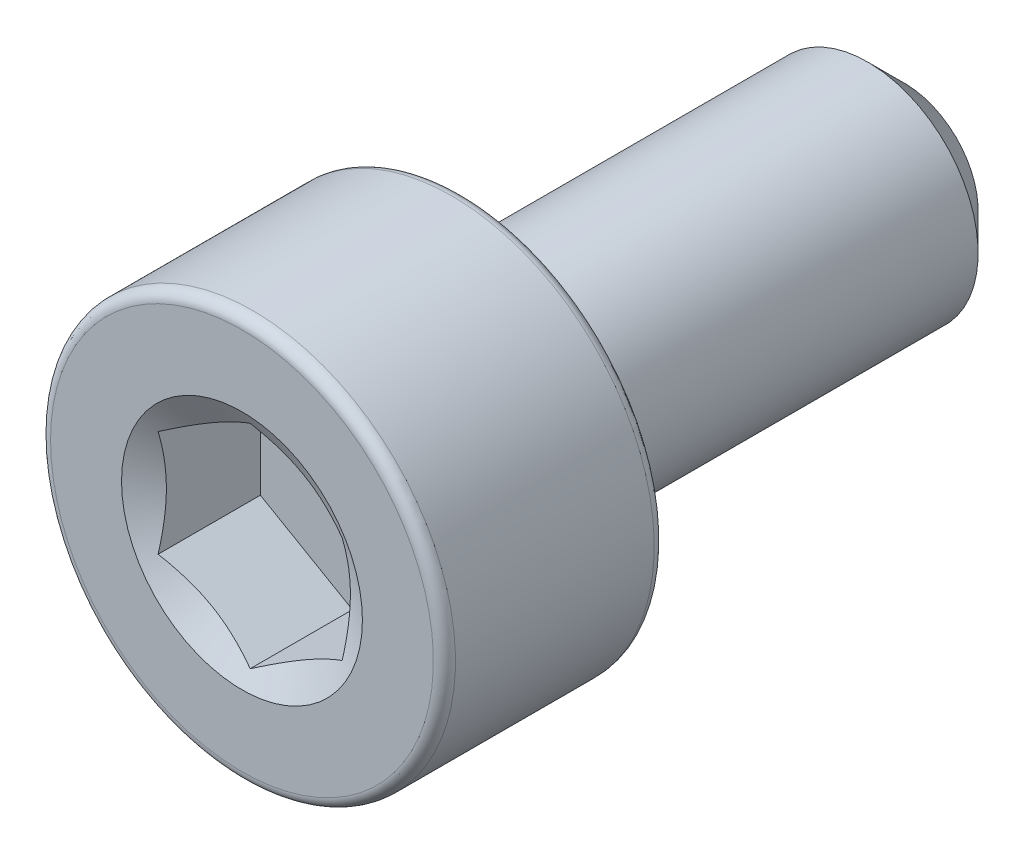
ISO-10303-21;
HEADER;
FILE_DESCRIPTION(('STEP AP214'),'2;1');
FILE_NAME('part.step','',(''),(''),'','','');
FILE_SCHEMA(('AUTOMOTIVE_DESIGN { 1 0 10303 214 1 1 1 1 }'));
ENDSEC;
DATA;
#1=APPLICATION_CONTEXT('core data for automotive mechanical design processes');
#2=APPLICATION_PROTOCOL_DEFINITION('international standard','automotive_design',2000,#1);
#3=PRODUCT_CONTEXT('',#1,'mechanical');
#4=PRODUCT('Part','Part','',(#3));
#5=PRODUCT_RELATED_PRODUCT_CATEGORY('part','',(#4));
#6=PRODUCT_DEFINITION_FORMATION('','',#4);
#7=PRODUCT_DEFINITION_CONTEXT('part definition',#1,'design');
#8=PRODUCT_DEFINITION('design','',#6,#7);
#9=PRODUCT_DEFINITION_SHAPE('','',#8);
#10=(LENGTH_UNIT() NAMED_UNIT(*) SI_UNIT(.MILLI.,.METRE.));
#11=(NAMED_UNIT(*) PLANE_ANGLE_UNIT() SI_UNIT($,.RADIAN.));
#12=(NAMED_UNIT(*) SI_UNIT($,.STERADIAN.) SOLID_ANGLE_UNIT());
#13=UNCERTAINTY_MEASURE_WITH_UNIT(LENGTH_MEASURE(1.E-05),#10,'distance_accuracy_value','');
#14=(GEOMETRIC_REPRESENTATION_CONTEXT(3) GLOBAL_UNCERTAINTY_ASSIGNED_CONTEXT((#13)) GLOBAL_UNIT_ASSIGNED_CONTEXT((#10,
#11,#12)) REPRESENTATION_CONTEXT('',''));
#15=CARTESIAN_POINT('',(0.,0.,0.));
#16=DIRECTION('',(0.,0.,1.));
#17=DIRECTION('',(1.,0.,0.));
#18=AXIS2_PLACEMENT_3D('',#15,#16,#17);
#19=CARTESIAN_POINT('',(0.,0.,-4.5));
#20=DIRECTION('',(0.,0.,-1.));
#21=DIRECTION('',(-1.,0.,0.));
#22=AXIS2_PLACEMENT_3D('',#19,#20,#21);
#23=PLANE('',#22);
#24=CARTESIAN_POINT('',(0.,0.,-4.5));
#25=DIRECTION('',(0.,0.,-1.));
#26=DIRECTION('',(-1.,0.,0.));
#27=AXIS2_PLACEMENT_3D('',#24,#25,#26);
#28=CIRCLE('',#27,1.);
#29=CARTESIAN_POINT('',(-1.,0.,-4.5));
#30=VERTEX_POINT('',#29);
#31=EDGE_CURVE('E54',#30,#30,#28,.T.);
#32=ORIENTED_EDGE('',*,*,#31,.T.);
#33=EDGE_LOOP('',(#32));
#34=FACE_BOUND('',#33,.T.);
#35=ADVANCED_FACE('F41',(#34),#23,.T.);
#36=CARTESIAN_POINT('',(0.,0.,-4.5));
#37=DIRECTION('',(0.,0.,1.));
#38=DIRECTION('',(1.,0.,0.));
#39=AXIS2_PLACEMENT_3D('',#36,#37,#38);
#40=CONICAL_SURFACE('',#39,1.,0.785398163397448);
#41=CARTESIAN_POINT('',(0.,0.,-4.));
#42=DIRECTION('',(0.,0.,-1.));
#43=DIRECTION('',(-1.,0.,0.));
#44=AXIS2_PLACEMENT_3D('',#41,#42,#43);
#45=CIRCLE('',#44,1.5);
#46=CARTESIAN_POINT('',(-1.5,0.,-4.));
#47=VERTEX_POINT('',#46);
#48=EDGE_CURVE('E139',#47,#47,#45,.T.);
#49=ORIENTED_EDGE('',*,*,#48,.T.);
#50=EDGE_LOOP('',(#49));
#51=FACE_BOUND('',#50,.T.);
#52=ORIENTED_EDGE('',*,*,#31,.F.);
#53=EDGE_LOOP('',(#52));
#54=FACE_BOUND('',#53,.T.);
#55=ADVANCED_FACE('F145',(#51,#54),#40,.T.);
#56=CARTESIAN_POINT('',(0.,0.,-4.5));
#57=DIRECTION('',(0.,0.,-1.));
#58=DIRECTION('',(-1.,0.,0.));
#59=AXIS2_PLACEMENT_3D('',#56,#57,#58);
#60=CYLINDRICAL_SURFACE('',#59,1.5);
#61=CARTESIAN_POINT('',(0.,0.,1.5));
#62=DIRECTION('',(0.,0.,-1.));
#63=DIRECTION('',(-1.,0.,0.));
#64=AXIS2_PLACEMENT_3D('',#61,#62,#63);
#65=CIRCLE('',#64,1.5);
#66=CARTESIAN_POINT('',(-1.5,0.,1.5));
#67=VERTEX_POINT('',#66);
#68=EDGE_CURVE('E136',#67,#67,#65,.T.);
#69=ORIENTED_EDGE('',*,*,#68,.T.);
#70=EDGE_LOOP('',(#69));
#71=FACE_BOUND('',#70,.T.);
#72=ORIENTED_EDGE('',*,*,#48,.F.);
#73=EDGE_LOOP('',(#72));
#74=FACE_BOUND('',#73,.T.);
#75=ADVANCED_FACE('F147',(#71,#74),#60,.T.);
#76=CARTESIAN_POINT('',(0.,1.5,1.5));
#77=DIRECTION('',(0.,0.,-1.));
#78=DIRECTION('',(-1.,0.,0.));
#79=AXIS2_PLACEMENT_3D('',#76,#77,#78);
#80=PLANE('',#79);
#81=CARTESIAN_POINT('',(0.,0.,1.5));
#82=DIRECTION('',(0.,0.,-1.));
#83=DIRECTION('',(-1.,0.,0.));
#84=AXIS2_PLACEMENT_3D('',#81,#82,#83);
#85=CIRCLE('',#84,2.6);
#86=CARTESIAN_POINT('',(-2.6,0.,1.5));
#87=VERTEX_POINT('',#86);
#88=EDGE_CURVE('E133',#87,#87,#85,.T.);
#89=ORIENTED_EDGE('',*,*,#88,.T.);
#90=EDGE_LOOP('',(#89));
#91=FACE_BOUND('',#90,.T.);
#92=ORIENTED_EDGE('',*,*,#68,.F.);
#93=EDGE_LOOP('',(#92));
#94=FACE_BOUND('',#93,.T.);
#95=ADVANCED_FACE('F153',(#91,#94),#80,.T.);
#96=CARTESIAN_POINT('',(0.,0.,1.65));
#97=DIRECTION('',(0.,0.,-1.));
#98=DIRECTION('',(-1.,0.,0.));
#99=AXIS2_PLACEMENT_3D('',#96,#97,#98);
#100=TOROIDAL_SURFACE('',#99,2.6,0.15);
#101=CARTESIAN_POINT('',(0.,0.,1.65));
#102=DIRECTION('',(0.,0.,-1.));
#103=DIRECTION('',(-1.,0.,0.));
#104=AXIS2_PLACEMENT_3D('',#101,#102,#103);
#105=CIRCLE('',#104,2.75);
#106=CARTESIAN_POINT('',(-2.75,0.,1.65));
#107=VERTEX_POINT('',#106);
#108=EDGE_CURVE('E130',#107,#107,#105,.T.);
#109=ORIENTED_EDGE('',*,*,#108,.T.);
#110=EDGE_LOOP('',(#109));
#111=FACE_BOUND('',#110,.T.);
#112=ORIENTED_EDGE('',*,*,#88,.F.);
#113=EDGE_LOOP('',(#112));
#114=FACE_BOUND('',#113,.T.);
#115=ADVANCED_FACE('F159',(#111,#114),#100,.T.);
#116=CARTESIAN_POINT('',(0.,0.,-4.5));
#117=DIRECTION('',(0.,0.,-1.));
#118=DIRECTION('',(-1.,0.,0.));
#119=AXIS2_PLACEMENT_3D('',#116,#117,#118);
#120=CYLINDRICAL_SURFACE('',#119,2.75);
#121=CARTESIAN_POINT('',(0.,0.,4.35));
#122=DIRECTION('',(0.,0.,-1.));
#123=DIRECTION('',(-1.,0.,0.));
#124=AXIS2_PLACEMENT_3D('',#121,#122,#123);
#125=CIRCLE('',#124,2.75);
#126=CARTESIAN_POINT('',(-2.75,0.,4.35));
#127=VERTEX_POINT('',#126);
#128=EDGE_CURVE('E127',#127,#127,#125,.T.);
#129=ORIENTED_EDGE('',*,*,#128,.T.);
#130=EDGE_LOOP('',(#129));
#131=FACE_BOUND('',#130,.T.);
#132=ORIENTED_EDGE('',*,*,#108,.F.);
#133=EDGE_LOOP('',(#132));
#134=FACE_BOUND('',#133,.T.);
#135=ADVANCED_FACE('F163',(#131,#134),#120,.T.);
#136=CARTESIAN_POINT('',(0.,0.,4.35));
#137=DIRECTION('',(0.,0.,-1.));
#138=DIRECTION('',(-1.,0.,0.));
#139=AXIS2_PLACEMENT_3D('',#136,#137,#138);
#140=TOROIDAL_SURFACE('',#139,2.6,0.15);
#141=CARTESIAN_POINT('',(0.,0.,4.5));
#142=DIRECTION('',(0.,0.,-1.));
#143=DIRECTION('',(-1.,0.,0.));
#144=AXIS2_PLACEMENT_3D('',#141,#142,#143);
#145=CIRCLE('',#144,2.6);
#146=CARTESIAN_POINT('',(-2.6,0.,4.5));
#147=VERTEX_POINT('',#146);
#148=EDGE_CURVE('E124',#147,#147,#145,.T.);
#149=ORIENTED_EDGE('',*,*,#148,.T.);
#150=EDGE_LOOP('',(#149));
#151=FACE_BOUND('',#150,.T.);
#152=ORIENTED_EDGE('',*,*,#128,.F.);
#153=EDGE_LOOP('',(#152));
#154=FACE_BOUND('',#153,.T.);
#155=ADVANCED_FACE('F167',(#151,#154),#140,.T.);
#156=CARTESIAN_POINT('',(0.,2.6,4.5));
#157=DIRECTION('',(0.,0.,1.));
#158=DIRECTION('',(1.,0.,0.));
#159=AXIS2_PLACEMENT_3D('',#156,#157,#158);
#160=PLANE('',#159);
#161=CARTESIAN_POINT('',(0.,0.,4.5));
#162=DIRECTION('',(0.,0.,1.));
#163=DIRECTION('',(1.,0.,0.));
#164=AXIS2_PLACEMENT_3D('',#161,#162,#163);
#165=CIRCLE('',#164,1.63614639414505);
#166=CARTESIAN_POINT('',(1.63614639414505,0.,4.5));
#167=VERTEX_POINT('',#166);
#168=EDGE_CURVE('E261',#167,#167,#165,.T.);
#169=ORIENTED_EDGE('',*,*,#168,.F.);
#170=EDGE_LOOP('',(#169));
#171=FACE_BOUND('',#170,.T.);
#172=ORIENTED_EDGE('',*,*,#148,.F.);
#173=EDGE_LOOP('',(#172));
#174=FACE_BOUND('',#173,.T.);
#175=ADVANCED_FACE('F171',(#171,#174),#160,.T.);
#176=CARTESIAN_POINT('',(0.,0.,4.5));
#177=DIRECTION('',(0.,0.,1.));
#178=DIRECTION('',(1.,0.,0.));
#179=AXIS2_PLACEMENT_3D('',#176,#177,#178);
#180=CONICAL_SURFACE('',#179,1.63614639414505,1.0471975511966);
#181=ORIENTED_EDGE('',*,*,#168,.T.);
#182=EDGE_LOOP('',(#181));
#183=FACE_BOUND('',#182,.T.);
#184=CARTESIAN_POINT('',(1.2502,0.721572366433193,4.38877044690608));
#185=CARTESIAN_POINT('',(1.19526669476823,0.753288124996228,4.37044968700374));
#186=CARTESIAN_POINT('',(1.13985921349976,0.785277649221701,4.35378707844069));
#187=CARTESIAN_POINT('',(1.02808463239966,0.849810733708402,4.32470107618582));
#188=CARTESIAN_POINT('',(0.971715545158288,0.88235544140118,4.3122879742161));
#189=CARTESIAN_POINT('',(0.859676025913014,0.947041487997316,4.29296345987606));
#190=CARTESIAN_POINT('',(0.804022841540769,0.979172868975891,4.28592346168748));
#191=CARTESIAN_POINT('',(0.692454346091608,1.04358696985655,4.27751620487069));
#192=CARTESIAN_POINT('',(0.636539441062399,1.07586945532687,4.27614198744478));
#193=CARTESIAN_POINT('',(0.532042078818274,1.13620103554812,4.27898710960797));
#194=CARTESIAN_POINT('',(0.483444050118684,1.16425912049992,4.28250787106007));
#195=CARTESIAN_POINT('',(0.386564637826761,1.22019247526559,4.29367088493931));
#196=CARTESIAN_POINT('',(0.338283589807836,1.24806755133607,4.30131695781273));
#197=CARTESIAN_POINT('',(0.241204116145956,1.30411641158755,4.32043322694058));
#198=CARTESIAN_POINT('',(0.1924179896481,1.3322830948538,4.33198452921971));
#199=CARTESIAN_POINT('',(0.0955737477078969,1.38819614400745,4.35820208693394));
#200=CARTESIAN_POINT('',(0.0475143896730347,1.41594322730595,4.37286217437916));
#201=CARTESIAN_POINT('',(-0.000200000000000998,1.4434911430279,4.38877044690608));
#202=B_SPLINE_CURVE_WITH_KNOTS('',3,(#184,#185,#186,#187,#188,#189,#190,#191,#192,#193,#194,
#195,#196,#197,#198,#199,#200,#201),.UNSPECIFIED.,.F.,.F.,(4,2,2,2,2,2,2,2,4),(0.,
0.198150821029559,0.39677819631522,0.590488617354399,0.783961049317181,0.952480056398645,
1.1211553973001,1.2935743034359,1.4656542697693),.UNSPECIFIED.);
#203=CARTESIAN_POINT('',(1.25,0.721687836487031,4.38870377224005));
#204=VERTEX_POINT('',#203);
#205=CARTESIAN_POINT('',(0.,1.44337567297406,4.38870377224005));
#206=VERTEX_POINT('',#205);
#207=EDGE_CURVE('E108',#204,#206,#202,.T.);
#208=ORIENTED_EDGE('',*,*,#207,.F.);
#209=CARTESIAN_POINT('',(1.25,-1.89493751838585,4.86600491612075));
#210=CARTESIAN_POINT('',(1.25,-1.8406706655359,4.83985913696477));
#211=CARTESIAN_POINT('',(1.25,-1.78627450159955,4.81397718008943));
#212=CARTESIAN_POINT('',(1.25,-1.6771542860939,4.76289014495151));
#213=CARTESIAN_POINT('',(1.25,-1.62243018006471,4.73768518315142));
#214=CARTESIAN_POINT('',(1.25,-1.51228150660141,4.68796514956817));
#215=CARTESIAN_POINT('',(1.25,-1.45685471363782,4.66345498656184));
#216=CARTESIAN_POINT('',(1.25,-1.34554530711243,4.61549912463354));
#217=CARTESIAN_POINT('',(1.25,-1.28966271671259,4.59205337201483));
#218=CARTESIAN_POINT('',(1.25,-1.17576624467955,4.5458644070109));
#219=CARTESIAN_POINT('',(1.25,-1.1177366233874,4.52315949733902));
#220=CARTESIAN_POINT('',(1.25,-1.00099484939335,4.4795841161061));
#221=CARTESIAN_POINT('',(1.25,-0.942282613107527,4.45871387193022));
#222=CARTESIAN_POINT('',(1.25,-0.765204349689549,4.39970721918192));
#223=CARTESIAN_POINT('',(1.25,-0.645583882597418,4.36504221898047));
#224=CARTESIAN_POINT('',(1.25,-0.463875702209306,4.32448382828725));
#225=CARTESIAN_POINT('',(1.25,-0.403068506127043,4.31288446104471));
#226=CARTESIAN_POINT('',(1.25,-0.280742753480582,4.29425184547974));
#227=CARTESIAN_POINT('',(1.25,-0.21922425475773,4.28721822850307));
#228=CARTESIAN_POINT('',(1.25,-0.0965698763728662,4.27836802265131));
#229=CARTESIAN_POINT('',(1.25,-0.0354387064128372,4.27648784576509));
#230=CARTESIAN_POINT('',(1.25,0.0867606380824925,4.27793281417568));
#231=CARTESIAN_POINT('',(1.25,0.147828809085717,4.28125823697792));
#232=CARTESIAN_POINT('',(1.25,0.296976974516787,4.29544420543106));
#233=CARTESIAN_POINT('',(1.25,0.384798095172699,4.30902990246888));
#234=CARTESIAN_POINT('',(1.25,0.558777035574827,4.34447190806478));
#235=CARTESIAN_POINT('',(1.25,0.644932779078741,4.36633791854767));
#236=CARTESIAN_POINT('',(1.25,0.77380914518999,4.40387295213096));
#237=CARTESIAN_POINT('',(1.25,0.817192381742851,4.41735279334266));
#238=CARTESIAN_POINT('',(1.25,0.903507427578148,4.44560647226415));
#239=CARTESIAN_POINT('',(1.25,0.94643949679064,4.4603795133102));
#240=CARTESIAN_POINT('',(1.25,1.0319081887352,4.49100070625673));
#241=CARTESIAN_POINT('',(1.25,1.07444487142949,4.50684869200918));
#242=CARTESIAN_POINT('',(1.25,1.1591793213938,4.53944353145431));
#243=CARTESIAN_POINT('',(1.25,1.20137703155215,4.55619053311117));
#244=CARTESIAN_POINT('',(1.25,1.31147066873609,4.6010154405937));
#245=CARTESIAN_POINT('',(1.25,1.37912101228275,4.62969595195012));
#246=CARTESIAN_POINT('',(1.25,1.51378271024307,4.68852402727517));
#247=CARTESIAN_POINT('',(1.25,1.58079400934832,4.71867171687233));
#248=CARTESIAN_POINT('',(1.25,1.78108956687594,4.81078601123408));
#249=CARTESIAN_POINT('',(1.25,1.91360872404133,4.87441259290478));
#250=CARTESIAN_POINT('',(1.25,2.1774904257434,5.00442585055039));
#251=CARTESIAN_POINT('',(1.25,2.30885117753144,5.07081611925632));
#252=CARTESIAN_POINT('',(1.25,2.57065126490253,5.2053391118623));
#253=CARTESIAN_POINT('',(1.25,2.70109073231446,5.2734715797448));
#254=CARTESIAN_POINT('',(1.25,2.94850263370539,5.40414820328686));
#255=CARTESIAN_POINT('',(1.25,3.06553428019949,5.46658065906644));
#256=CARTESIAN_POINT('',(1.25,3.29922001606908,5.59215959614652));
#257=CARTESIAN_POINT('',(1.25,3.41587408902236,5.6553061079814));
#258=CARTESIAN_POINT('',(1.25,3.64856969126785,5.78195631097186));
#259=CARTESIAN_POINT('',(1.25,3.76461202236081,5.84545853098273));
#260=CARTESIAN_POINT('',(1.25,3.99646186521794,5.97287436696805));
#261=CARTESIAN_POINT('',(1.25,4.11226939030719,6.03678795868639));
#262=CARTESIAN_POINT('',(1.25,4.22799321071853,6.10085183344894));
#263=B_SPLINE_CURVE_WITH_KNOTS('',3,(#209,#210,#211,#212,#213,#214,#215,#216,#217,#218,#219,
#220,#221,#222,#223,#224,#225,#226,#227,#228,#229,#230,#231,#232,#233,#234,#235,#236,#237,#238,
#239,#240,#241,#242,#243,#244,#245,#246,#247,#248,#249,#250,#251,#252,#253,#254,#255,#256,#257,
#258,#259,#260,#261,#262),.UNSPECIFIED.,.F.,.F.,(4,2,2,2,2,2,2,2,2,2,2,2,2,2,2,2,2,2,2,2,2,2,2,
2,2,2,4),(0.,0.180713106709462,0.361457104672351,0.543260352902969,0.725054419415468,
0.911961247319593,1.09889120755788,1.47173308257774,1.65730634844025,1.84286462862096,
2.02612278274385,2.20939070651185,2.47544204664139,2.74180608470687,2.87807807877767,
3.0142667067179,3.15043433252002,3.28662443853954,3.50703539668476,3.72746526104871,
4.16841202675703,4.60995110052815,5.05142565849164,5.44935247276722,5.84729636797905,
6.24413951198687,6.64095946708081),.UNSPECIFIED.);
#264=CARTESIAN_POINT('',(1.25,-0.721687836487031,4.38870377224005));
#265=VERTEX_POINT('',#264);
#266=EDGE_CURVE('E217',#265,#204,#263,.T.);
#267=ORIENTED_EDGE('',*,*,#266,.F.);
#268=CARTESIAN_POINT('',(-0.000200000000000907,-1.4434911430279,4.38877044690608));
#269=CARTESIAN_POINT('',(0.054733305231764,-1.41177538446487,4.37044968700374));
#270=CARTESIAN_POINT('',(0.110140786500238,-1.37978586023939,4.35378707844069));
#271=CARTESIAN_POINT('',(0.221915367600339,-1.31525277575269,4.32470107618582));
#272=CARTESIAN_POINT('',(0.278284454841709,-1.28270806805991,4.3122879742161));
#273=CARTESIAN_POINT('',(0.390323974086983,-1.21802202146378,4.29296345987606));
#274=CARTESIAN_POINT('',(0.445977158459228,-1.1858906404852,4.28592346168748));
#275=CARTESIAN_POINT('',(0.55754565390839,-1.12147653960455,4.27751620487069));
#276=CARTESIAN_POINT('',(0.613460558937598,-1.08919405413422,4.27614198744478));
#277=CARTESIAN_POINT('',(0.717957921181723,-1.02886247391297,4.27898710960797));
#278=CARTESIAN_POINT('',(0.766555949881314,-1.00080438896118,4.28250787106007));
#279=CARTESIAN_POINT('',(0.863435362173236,-0.944871034195502,4.29367088493931));
#280=CARTESIAN_POINT('',(0.911716410192161,-0.916995958125018,4.30131695781273));
#281=CARTESIAN_POINT('',(1.00879588385404,-0.860947097873545,4.32043322694058));
#282=CARTESIAN_POINT('',(1.0575820103519,-0.832780414607288,4.33198452921971));
#283=CARTESIAN_POINT('',(1.1544262522921,-0.776867365453647,4.35820208693394));
#284=CARTESIAN_POINT('',(1.20248561032696,-0.749120282155139,4.37286217437916));
#285=CARTESIAN_POINT('',(1.2502,-0.721572366433193,4.38877044690608));
#286=B_SPLINE_CURVE_WITH_KNOTS('',3,(#268,#269,#270,#271,#272,#273,#274,#275,#276,#277,#278,
#279,#280,#281,#282,#283,#284,#285),.UNSPECIFIED.,.F.,.F.,(4,2,2,2,2,2,2,2,4),(0.,
0.198150821029559,0.39677819631522,0.590488617354399,0.783961049317181,0.952480056398645,
1.1211553973001,1.2935743034359,1.4656542697693),.UNSPECIFIED.);
#287=CARTESIAN_POINT('',(0.,-1.44337567297406,4.38870377224005));
#288=VERTEX_POINT('',#287);
#289=EDGE_CURVE('E211',#288,#265,#286,.T.);
#290=ORIENTED_EDGE('',*,*,#289,.F.);
#291=CARTESIAN_POINT('',(-1.2502,-0.721572366433194,4.38877044690608));
#292=CARTESIAN_POINT('',(-1.19526669476823,-0.753288124996229,4.37044968700374));
#293=CARTESIAN_POINT('',(-1.13985921349976,-0.785277649221702,4.35378707844069));
#294=CARTESIAN_POINT('',(-1.02808463239966,-0.849810733708403,4.32470107618582));
#295=CARTESIAN_POINT('',(-0.971715545158288,-0.882355441401181,4.3122879742161));
#296=CARTESIAN_POINT('',(-0.859676025913014,-0.947041487997316,4.29296345987606));
#297=CARTESIAN_POINT('',(-0.804022841540769,-0.979172868975892,4.28592346168749));
#298=CARTESIAN_POINT('',(-0.692454346091607,-1.04358696985655,4.27751620487069));
#299=CARTESIAN_POINT('',(-0.636539441062398,-1.07586945532687,4.27614198744478));
#300=CARTESIAN_POINT('',(-0.532042078818274,-1.13620103554812,4.27898710960797));
#301=CARTESIAN_POINT('',(-0.483444050118684,-1.16425912049992,4.28250787106007));
#302=CARTESIAN_POINT('',(-0.386564637826761,-1.22019247526559,4.29367088493931));
#303=CARTESIAN_POINT('',(-0.338283589807837,-1.24806755133608,4.30131695781273));
#304=CARTESIAN_POINT('',(-0.241204116145957,-1.30411641158755,4.32043322694058));
#305=CARTESIAN_POINT('',(-0.192417989648101,-1.33228309485381,4.33198452921971));
#306=CARTESIAN_POINT('',(-0.0955737477078985,-1.38819614400745,4.35820208693394));
#307=CARTESIAN_POINT('',(-0.0475143896730366,-1.41594322730595,4.37286217437916));
#308=CARTESIAN_POINT('',(0.000199999999998921,-1.4434911430279,4.38877044690608));
#309=B_SPLINE_CURVE_WITH_KNOTS('',3,(#291,#292,#293,#294,#295,#296,#297,#298,#299,#300,#301,
#302,#303,#304,#305,#306,#307,#308),.UNSPECIFIED.,.F.,.F.,(4,2,2,2,2,2,2,2,4),(0.,
0.198150821029559,0.39677819631522,0.590488617354399,0.783961049317181,0.952480056398644,
1.12115539730009,1.2935743034359,1.4656542697693),.UNSPECIFIED.);
#310=CARTESIAN_POINT('',(-1.25,-0.721687836487032,4.38870377224005));
#311=VERTEX_POINT('',#310);
#312=EDGE_CURVE('E61',#311,#288,#309,.T.);
#313=ORIENTED_EDGE('',*,*,#312,.F.);
#314=CARTESIAN_POINT('',(-1.25,-1.89493751838585,4.86600491612075));
#315=CARTESIAN_POINT('',(-1.25,-1.84067066553591,4.83985913696477));
#316=CARTESIAN_POINT('',(-1.25,-1.78627450159955,4.81397718008943));
#317=CARTESIAN_POINT('',(-1.25,-1.6771542860939,4.76289014495151));
#318=CARTESIAN_POINT('',(-1.25,-1.62243018006471,4.73768518315142));
#319=CARTESIAN_POINT('',(-1.25,-1.51228150660141,4.68796514956817));
#320=CARTESIAN_POINT('',(-1.25,-1.45685471363782,4.66345498656184));
#321=CARTESIAN_POINT('',(-1.25,-1.34554530711243,4.61549912463354));
#322=CARTESIAN_POINT('',(-1.25,-1.28966271671259,4.59205337201483));
#323=CARTESIAN_POINT('',(-1.25,-1.17576624467955,4.5458644070109));
#324=CARTESIAN_POINT('',(-1.25,-1.1177366233874,4.52315949733902));
#325=CARTESIAN_POINT('',(-1.25,-1.00099484939336,4.4795841161061));
#326=CARTESIAN_POINT('',(-1.25,-0.942282613107528,4.45871387193022));
#327=CARTESIAN_POINT('',(-1.25,-0.76520434968955,4.39970721918192));
#328=CARTESIAN_POINT('',(-1.25,-0.645583882597419,4.36504221898047));
#329=CARTESIAN_POINT('',(-1.25,-0.463875702209307,4.32448382828725));
#330=CARTESIAN_POINT('',(-1.25,-0.403068506127044,4.31288446104471));
#331=CARTESIAN_POINT('',(-1.25,-0.280742753480583,4.29425184547974));
#332=CARTESIAN_POINT('',(-1.25,-0.219224254757731,4.28721822850307));
#333=CARTESIAN_POINT('',(-1.25,-0.0965698763728668,4.27836802265131));
#334=CARTESIAN_POINT('',(-1.25,-0.0354387064128378,4.27648784576509));
#335=CARTESIAN_POINT('',(-1.25,0.0867606380824919,4.27793281417568));
#336=CARTESIAN_POINT('',(-1.25,0.147828809085716,4.28125823697792));
#337=CARTESIAN_POINT('',(-1.25,0.296976974516786,4.29544420543106));
#338=CARTESIAN_POINT('',(-1.25,0.384798095172698,4.30902990246888));
#339=CARTESIAN_POINT('',(-1.25,0.558777035574826,4.34447190806478));
#340=CARTESIAN_POINT('',(-1.25,0.64493277907874,4.36633791854767));
#341=CARTESIAN_POINT('',(-1.25,0.773809145189989,4.40387295213096));
#342=CARTESIAN_POINT('',(-1.25,0.81719238174285,4.41735279334266));
#343=CARTESIAN_POINT('',(-1.25,0.903507427578147,4.44560647226415));
#344=CARTESIAN_POINT('',(-1.25,0.946439496790639,4.4603795133102));
#345=CARTESIAN_POINT('',(-1.25,1.0319081887352,4.49100070625673));
#346=CARTESIAN_POINT('',(-1.25,1.07444487142949,4.50684869200918));
#347=CARTESIAN_POINT('',(-1.25,1.1591793213938,4.53944353145431));
#348=CARTESIAN_POINT('',(-1.25,1.20137703155215,4.55619053311117));
#349=CARTESIAN_POINT('',(-1.25,1.31147066873608,4.6010154405937));
#350=CARTESIAN_POINT('',(-1.25,1.37912101228275,4.62969595195012));
#351=CARTESIAN_POINT('',(-1.25,1.51378271024307,4.68852402727517));
#352=CARTESIAN_POINT('',(-1.25,1.58079400934832,4.71867171687233));
#353=CARTESIAN_POINT('',(-1.25,1.78108956687594,4.81078601123408));
#354=CARTESIAN_POINT('',(-1.25,1.91360872404133,4.87441259290478));
#355=CARTESIAN_POINT('',(-1.25,2.1774904257434,5.00442585055039));
#356=CARTESIAN_POINT('',(-1.25,2.30885117753144,5.07081611925632));
#357=CARTESIAN_POINT('',(-1.25,2.57065126490253,5.2053391118623));
#358=CARTESIAN_POINT('',(-1.25,2.70109073231446,5.2734715797448));
#359=CARTESIAN_POINT('',(-1.25,2.9485026337054,5.40414820328686));
#360=CARTESIAN_POINT('',(-1.25,3.06553428019949,5.46658065906644));
#361=CARTESIAN_POINT('',(-1.25,3.29922001606908,5.59215959614652));
#362=CARTESIAN_POINT('',(-1.25,3.41587408902236,5.6553061079814));
#363=CARTESIAN_POINT('',(-1.25,3.64856969126785,5.78195631097186));
#364=CARTESIAN_POINT('',(-1.25,3.76461202236081,5.84545853098273));
#365=CARTESIAN_POINT('',(-1.25,3.99646186521795,5.97287436696805));
#366=CARTESIAN_POINT('',(-1.25,4.1122693903072,6.03678795868639));
#367=CARTESIAN_POINT('',(-1.25,4.22799321071854,6.10085183344894));
#368=B_SPLINE_CURVE_WITH_KNOTS('',3,(#314,#315,#316,#317,#318,#319,#320,#321,#322,#323,#324,
#325,#326,#327,#328,#329,#330,#331,#332,#333,#334,#335,#336,#337,#338,#339,#340,#341,#342,#343,
#344,#345,#346,#347,#348,#349,#350,#351,#352,#353,#354,#355,#356,#357,#358,#359,#360,#361,#362,
#363,#364,#365,#366,#367),.UNSPECIFIED.,.F.,.F.,(4,2,2,2,2,2,2,2,2,2,2,2,2,2,2,2,2,2,2,2,2,2,2,
2,2,2,4),(0.,0.180713106709462,0.361457104672351,0.543260352902969,0.725054419415468,
0.911961247319592,1.09889120755788,1.47173308257774,1.65730634844025,1.84286462862096,
2.02612278274384,2.20939070651185,2.47544204664139,2.74180608470687,2.87807807877766,
3.0142667067179,3.15043433252001,3.28662443853954,3.50703539668476,3.72746526104871,
4.16841202675703,4.60995110052814,5.05142565849164,5.44935247276722,5.84729636797905,
6.24413951198687,6.64095946708081),.UNSPECIFIED.);
#369=CARTESIAN_POINT('',(-1.25,0.721687836487031,4.38870377224005));
#370=VERTEX_POINT('',#369);
#371=EDGE_CURVE('E11',#370,#311,#368,.F.);
#372=ORIENTED_EDGE('',*,*,#371,.F.);
#373=CARTESIAN_POINT('',(0.000199999999998955,1.4434911430279,4.38877044690608));
#374=CARTESIAN_POINT('',(-0.0547333052317661,1.41177538446487,4.37044968700374));
#375=CARTESIAN_POINT('',(-0.110140786500241,1.37978586023939,4.35378707844069));
#376=CARTESIAN_POINT('',(-0.221915367600341,1.31525277575269,4.32470107618582));
#377=CARTESIAN_POINT('',(-0.278284454841711,1.28270806805991,4.3122879742161));
#378=CARTESIAN_POINT('',(-0.390323974086985,1.21802202146378,4.29296345987606));
#379=CARTESIAN_POINT('',(-0.44597715845923,1.1858906404852,4.28592346168749));
#380=CARTESIAN_POINT('',(-0.557545653908392,1.12147653960455,4.27751620487069));
#381=CARTESIAN_POINT('',(-0.6134605589376,1.08919405413422,4.27614198744478));
#382=CARTESIAN_POINT('',(-0.717957921181725,1.02886247391297,4.27898710960797));
#383=CARTESIAN_POINT('',(-0.766555949881315,1.00080438896118,4.28250787106007));
#384=CARTESIAN_POINT('',(-0.863435362173238,0.944871034195502,4.29367088493931));
#385=CARTESIAN_POINT('',(-0.911716410192162,0.916995958125019,4.30131695781273));
#386=CARTESIAN_POINT('',(-1.00879588385404,0.860947097873545,4.32043322694058));
#387=CARTESIAN_POINT('',(-1.0575820103519,0.832780414607289,4.33198452921971));
#388=CARTESIAN_POINT('',(-1.1544262522921,0.776867365453647,4.35820208693394));
#389=CARTESIAN_POINT('',(-1.20248561032696,0.749120282155139,4.37286217437916));
#390=CARTESIAN_POINT('',(-1.2502,0.721572366433193,4.38877044690608));
#391=B_SPLINE_CURVE_WITH_KNOTS('',3,(#373,#374,#375,#376,#377,#378,#379,#380,#381,#382,#383,
#384,#385,#386,#387,#388,#389,#390),.UNSPECIFIED.,.F.,.F.,(4,2,2,2,2,2,2,2,4),(0.,
0.198150821029559,0.39677819631522,0.590488617354399,0.783961049317181,0.952480056398644,
1.1211553973001,1.2935743034359,1.4656542697693),.UNSPECIFIED.);
#392=EDGE_CURVE('E99',#206,#370,#391,.T.);
#393=ORIENTED_EDGE('',*,*,#392,.F.);
#394=EDGE_LOOP('',(#208,#267,#290,#313,#372,#393));
#395=FACE_BOUND('',#394,.T.);
#396=ADVANCED_FACE('F98',(#183,#395),#180,.F.);
#397=CARTESIAN_POINT('',(0.,0.,3.));
#398=DIRECTION('',(0.,0.,1.));
#399=DIRECTION('',(1.,0.,0.));
#400=AXIS2_PLACEMENT_3D('',#397,#398,#399);
#401=PLANE('',#400);
#402=DIRECTION('',(-0.866025403784438,-0.5,0.));
#403=VECTOR('',#402,1.);
#404=CARTESIAN_POINT('',(0.,1.44337567297406,3.));
#405=LINE('',#404,#403);
#406=CARTESIAN_POINT('',(0.,1.44337567297406,3.));
#407=VERTEX_POINT('',#406);
#408=CARTESIAN_POINT('',(-1.25,0.721687836487031,3.));
#409=VERTEX_POINT('',#408);
#410=EDGE_CURVE('E107',#407,#409,#405,.T.);
#411=ORIENTED_EDGE('',*,*,#410,.T.);
#412=DIRECTION('',(0.,-1.,0.));
#413=VECTOR('',#412,1.);
#414=CARTESIAN_POINT('',(-1.25,0.721687836487031,3.));
#415=LINE('',#414,#413);
#416=CARTESIAN_POINT('',(-1.25,-0.721687836487032,3.));
#417=VERTEX_POINT('',#416);
#418=EDGE_CURVE('E112',#409,#417,#415,.T.);
#419=ORIENTED_EDGE('',*,*,#418,.T.);
#420=DIRECTION('',(0.866025403784438,-0.5,0.));
#421=VECTOR('',#420,1.);
#422=CARTESIAN_POINT('',(-1.25,-0.721687836487032,3.));
#423=LINE('',#422,#421);
#424=CARTESIAN_POINT('',(0.,-1.44337567297406,3.));
#425=VERTEX_POINT('',#424);
#426=EDGE_CURVE('E243',#417,#425,#423,.T.);
#427=ORIENTED_EDGE('',*,*,#426,.T.);
#428=DIRECTION('',(0.866025403784439,0.5,0.));
#429=VECTOR('',#428,1.);
#430=CARTESIAN_POINT('',(0.,-1.44337567297406,3.));
#431=LINE('',#430,#429);
#432=CARTESIAN_POINT('',(1.25,-0.721687836487031,3.));
#433=VERTEX_POINT('',#432);
#434=EDGE_CURVE('E247',#425,#433,#431,.T.);
#435=ORIENTED_EDGE('',*,*,#434,.T.);
#436=DIRECTION('',(0.,1.,0.));
#437=VECTOR('',#436,1.);
#438=CARTESIAN_POINT('',(1.25,-0.721687836487031,3.));
#439=LINE('',#438,#437);
#440=CARTESIAN_POINT('',(1.25,0.721687836487031,3.));
#441=VERTEX_POINT('',#440);
#442=EDGE_CURVE('E120',#433,#441,#439,.T.);
#443=ORIENTED_EDGE('',*,*,#442,.T.);
#444=DIRECTION('',(-0.866025403784439,0.5,0.));
#445=VECTOR('',#444,1.);
#446=CARTESIAN_POINT('',(1.25,0.721687836487031,3.));
#447=LINE('',#446,#445);
#448=EDGE_CURVE('E115',#441,#407,#447,.T.);
#449=ORIENTED_EDGE('',*,*,#448,.T.);
#450=EDGE_LOOP('',(#411,#419,#427,#435,#443,#449));
#451=FACE_BOUND('',#450,.T.);
#452=ADVANCED_FACE('F197',(#451),#401,.T.);
#453=CARTESIAN_POINT('',(-1.25,0.721687836487031,3.));
#454=DIRECTION('',(-1.,0.,0.));
#455=DIRECTION('',(0.,-1.,0.));
#456=AXIS2_PLACEMENT_3D('',#453,#454,#455);
#457=PLANE('',#456);
#458=DIRECTION('',(0.,0.,1.));
#459=VECTOR('',#458,1.);
#460=CARTESIAN_POINT('',(-1.25,0.721687836487031,3.));
#461=LINE('',#460,#459);
#462=EDGE_CURVE('E105',#409,#370,#461,.T.);
#463=ORIENTED_EDGE('',*,*,#462,.T.);
#464=ORIENTED_EDGE('',*,*,#371,.T.);
#465=DIRECTION('',(0.,0.,1.));
#466=VECTOR('',#465,1.);
#467=CARTESIAN_POINT('',(-1.25,-0.721687836487032,3.));
#468=LINE('',#467,#466);
#469=EDGE_CURVE('E114',#417,#311,#468,.T.);
#470=ORIENTED_EDGE('',*,*,#469,.F.);
#471=ORIENTED_EDGE('',*,*,#418,.F.);
#472=EDGE_LOOP('',(#463,#464,#470,#471));
#473=FACE_BOUND('',#472,.T.);
#474=ADVANCED_FACE('F110',(#473),#457,.F.);
#475=CARTESIAN_POINT('',(-1.25,-0.721687836487032,3.));
#476=DIRECTION('',(-0.5,-0.866025403784439,0.));
#477=DIRECTION('',(0.866025403784439,-0.5,0.));
#478=AXIS2_PLACEMENT_3D('',#475,#476,#477);
#479=PLANE('',#478);
#480=ORIENTED_EDGE('',*,*,#469,.T.);
#481=ORIENTED_EDGE('',*,*,#312,.T.);
#482=DIRECTION('',(0.,0.,1.));
#483=VECTOR('',#482,1.);
#484=CARTESIAN_POINT('',(0.,-1.44337567297406,3.));
#485=LINE('',#484,#483);
#486=EDGE_CURVE('E117',#425,#288,#485,.T.);
#487=ORIENTED_EDGE('',*,*,#486,.F.);
#488=ORIENTED_EDGE('',*,*,#426,.F.);
#489=EDGE_LOOP('',(#480,#481,#487,#488));
#490=FACE_BOUND('',#489,.T.);
#491=ADVANCED_FACE('F232',(#490),#479,.F.);
#492=CARTESIAN_POINT('',(0.,-1.44337567297406,3.));
#493=DIRECTION('',(0.5,-0.866025403784438,0.));
#494=DIRECTION('',(0.866025403784439,0.5,0.));
#495=AXIS2_PLACEMENT_3D('',#492,#493,#494);
#496=PLANE('',#495);
#497=ORIENTED_EDGE('',*,*,#486,.T.);
#498=ORIENTED_EDGE('',*,*,#289,.T.);
#499=DIRECTION('',(0.,0.,1.));
#500=VECTOR('',#499,1.);
#501=CARTESIAN_POINT('',(1.25,-0.721687836487031,3.));
#502=LINE('',#501,#500);
#503=EDGE_CURVE('E257',#433,#265,#502,.T.);
#504=ORIENTED_EDGE('',*,*,#503,.F.);
#505=ORIENTED_EDGE('',*,*,#434,.F.);
#506=EDGE_LOOP('',(#497,#498,#504,#505));
#507=FACE_BOUND('',#506,.T.);
#508=ADVANCED_FACE('F227',(#507),#496,.F.);
#509=CARTESIAN_POINT('',(1.25,-0.721687836487031,3.));
#510=DIRECTION('',(1.,0.,0.));
#511=DIRECTION('',(0.,1.,0.));
#512=AXIS2_PLACEMENT_3D('',#509,#510,#511);
#513=PLANE('',#512);
#514=ORIENTED_EDGE('',*,*,#503,.T.);
#515=ORIENTED_EDGE('',*,*,#266,.T.);
#516=DIRECTION('',(0.,0.,1.));
#517=VECTOR('',#516,1.);
#518=CARTESIAN_POINT('',(1.25,0.721687836487031,3.));
#519=LINE('',#518,#517);
#520=EDGE_CURVE('E254',#441,#204,#519,.T.);
#521=ORIENTED_EDGE('',*,*,#520,.F.);
#522=ORIENTED_EDGE('',*,*,#442,.F.);
#523=EDGE_LOOP('',(#514,#515,#521,#522));
#524=FACE_BOUND('',#523,.T.);
#525=ADVANCED_FACE('F224',(#524),#513,.F.);
#526=CARTESIAN_POINT('',(1.25,0.721687836487031,3.));
#527=DIRECTION('',(0.5,0.866025403784439,0.));
#528=DIRECTION('',(-0.866025403784439,0.5,0.));
#529=AXIS2_PLACEMENT_3D('',#526,#527,#528);
#530=PLANE('',#529);
#531=ORIENTED_EDGE('',*,*,#520,.T.);
#532=ORIENTED_EDGE('',*,*,#207,.T.);
#533=DIRECTION('',(0.,0.,1.));
#534=VECTOR('',#533,1.);
#535=CARTESIAN_POINT('',(0.,1.44337567297406,3.));
#536=LINE('',#535,#534);
#537=EDGE_CURVE('E68',#407,#206,#536,.T.);
#538=ORIENTED_EDGE('',*,*,#537,.F.);
#539=ORIENTED_EDGE('',*,*,#448,.F.);
#540=EDGE_LOOP('',(#531,#532,#538,#539));
#541=FACE_BOUND('',#540,.T.);
#542=ADVANCED_FACE('F178',(#541),#530,.F.);
#543=CARTESIAN_POINT('',(0.,1.44337567297406,3.));
#544=DIRECTION('',(-0.5,0.866025403784438,0.));
#545=DIRECTION('',(-0.866025403784439,-0.5,0.));
#546=AXIS2_PLACEMENT_3D('',#543,#544,#545);
#547=PLANE('',#546);
#548=ORIENTED_EDGE('',*,*,#537,.T.);
#549=ORIENTED_EDGE('',*,*,#392,.T.);
#550=ORIENTED_EDGE('',*,*,#462,.F.);
#551=ORIENTED_EDGE('',*,*,#410,.F.);
#552=EDGE_LOOP('',(#548,#549,#550,#551));
#553=FACE_BOUND('',#552,.T.);
#554=ADVANCED_FACE('F104',(#553),#547,.F.);
#555=CLOSED_SHELL('',(#35,#55,#75,#95,#115,#135,#155,#175,#396,#452,#474,#491,#508,#525,#542,#554));
#556=MANIFOLD_SOLID_BREP('B2',#555);
#557=ADVANCED_BREP_SHAPE_REPRESENTATION('',(#18,#556),#14);
#558=SHAPE_DEFINITION_REPRESENTATION(#9,#557);
ENDSEC;
END-ISO-10303-21;
